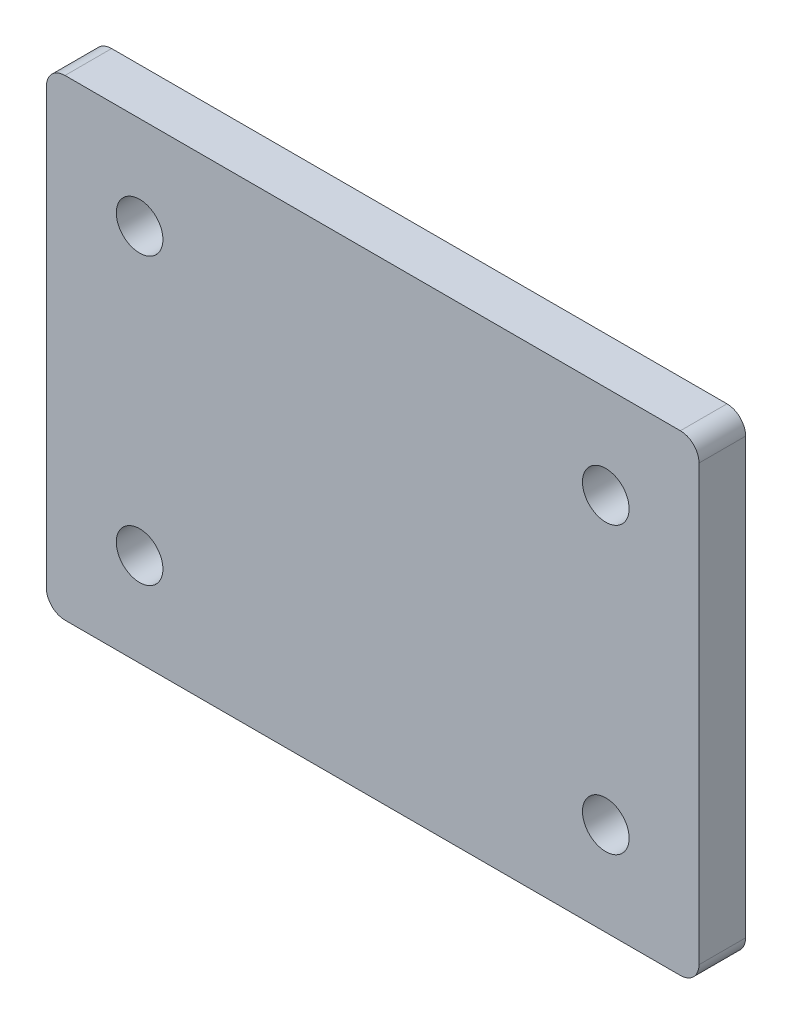
ISO-10303-21;
HEADER;
FILE_DESCRIPTION(('STEP AP214'),'2;1');
FILE_NAME('part.step','',(''),(''),'','','');
FILE_SCHEMA(('AUTOMOTIVE_DESIGN { 1 0 10303 214 1 1 1 1 }'));
ENDSEC;
DATA;
#1=APPLICATION_CONTEXT('core data for automotive mechanical design processes');
#2=APPLICATION_PROTOCOL_DEFINITION('international standard','automotive_design',2000,#1);
#3=PRODUCT_CONTEXT('',#1,'mechanical');
#4=PRODUCT('Part','Part','',(#3));
#5=PRODUCT_RELATED_PRODUCT_CATEGORY('part','',(#4));
#6=PRODUCT_DEFINITION_FORMATION('','',#4);
#7=PRODUCT_DEFINITION_CONTEXT('part definition',#1,'design');
#8=PRODUCT_DEFINITION('design','',#6,#7);
#9=PRODUCT_DEFINITION_SHAPE('','',#8);
#10=(LENGTH_UNIT() NAMED_UNIT(*) SI_UNIT(.MILLI.,.METRE.));
#11=(NAMED_UNIT(*) PLANE_ANGLE_UNIT() SI_UNIT($,.RADIAN.));
#12=(NAMED_UNIT(*) SI_UNIT($,.STERADIAN.) SOLID_ANGLE_UNIT());
#13=UNCERTAINTY_MEASURE_WITH_UNIT(LENGTH_MEASURE(1.E-05),#10,'distance_accuracy_value','');
#14=(GEOMETRIC_REPRESENTATION_CONTEXT(3) GLOBAL_UNCERTAINTY_ASSIGNED_CONTEXT((#13)) GLOBAL_UNIT_ASSIGNED_CONTEXT((#10,
#11,#12)) REPRESENTATION_CONTEXT('',''));
#15=CARTESIAN_POINT('',(0.,0.,0.));
#16=DIRECTION('',(0.,0.,1.));
#17=DIRECTION('',(1.,0.,0.));
#18=AXIS2_PLACEMENT_3D('',#15,#16,#17);
#19=CARTESIAN_POINT('',(44.45,-32.12973,6.35));
#20=DIRECTION('',(-1.,0.,0.));
#21=DIRECTION('',(0.,0.,1.));
#22=AXIS2_PLACEMENT_3D('',#19,#20,#21);
#23=PLANE('',#22);
#24=DIRECTION('',(0.,1.,0.));
#25=VECTOR('',#24,1.);
#26=CARTESIAN_POINT('',(44.45,-32.12973,6.35));
#27=LINE('',#26,#25);
#28=CARTESIAN_POINT('',(44.45,-29.58973,6.35));
#29=VERTEX_POINT('',#28);
#30=CARTESIAN_POINT('',(44.45,29.58973,6.35));
#31=VERTEX_POINT('',#30);
#32=EDGE_CURVE('E126',#29,#31,#27,.T.);
#33=ORIENTED_EDGE('',*,*,#32,.F.);
#34=DIRECTION('',(0.,0.,-1.));
#35=VECTOR('',#34,1.);
#36=CARTESIAN_POINT('',(44.45,-29.58973,6.35));
#37=LINE('',#36,#35);
#38=CARTESIAN_POINT('',(44.45,-29.58973,0.));
#39=VERTEX_POINT('',#38);
#40=EDGE_CURVE('E110',#29,#39,#37,.T.);
#41=ORIENTED_EDGE('',*,*,#40,.T.);
#42=DIRECTION('',(0.,1.,0.));
#43=VECTOR('',#42,1.);
#44=CARTESIAN_POINT('',(44.45,-32.12973,0.));
#45=LINE('',#44,#43);
#46=CARTESIAN_POINT('',(44.45,29.58973,0.));
#47=VERTEX_POINT('',#46);
#48=EDGE_CURVE('E123',#39,#47,#45,.T.);
#49=ORIENTED_EDGE('',*,*,#48,.T.);
#50=DIRECTION('',(0.,0.,-1.));
#51=VECTOR('',#50,1.);
#52=CARTESIAN_POINT('',(44.45,29.58973,6.35));
#53=LINE('',#52,#51);
#54=EDGE_CURVE('E129',#47,#31,#53,.F.);
#55=ORIENTED_EDGE('',*,*,#54,.T.);
#56=EDGE_LOOP('',(#33,#41,#49,#55));
#57=FACE_BOUND('',#56,.T.);
#58=ADVANCED_FACE('F39',(#57),#23,.F.);
#59=CARTESIAN_POINT('',(-44.45,32.12973,6.35));
#60=DIRECTION('',(0.,-1.,0.));
#61=DIRECTION('',(0.,0.,-1.));
#62=AXIS2_PLACEMENT_3D('',#59,#60,#61);
#63=PLANE('',#62);
#64=DIRECTION('',(-1.,0.,0.));
#65=VECTOR('',#64,1.);
#66=CARTESIAN_POINT('',(-44.45,32.12973,0.));
#67=LINE('',#66,#65);
#68=CARTESIAN_POINT('',(41.91,32.12973,0.));
#69=VERTEX_POINT('',#68);
#70=CARTESIAN_POINT('',(-41.91,32.12973,0.));
#71=VERTEX_POINT('',#70);
#72=EDGE_CURVE('E134',#69,#71,#67,.T.);
#73=ORIENTED_EDGE('',*,*,#72,.T.);
#74=DIRECTION('',(0.,0.,-1.));
#75=VECTOR('',#74,1.);
#76=CARTESIAN_POINT('',(-41.91,32.12973,6.35));
#77=LINE('',#76,#75);
#78=CARTESIAN_POINT('',(-41.91,32.12973,6.35));
#79=VERTEX_POINT('',#78);
#80=EDGE_CURVE('E11',#71,#79,#77,.F.);
#81=ORIENTED_EDGE('',*,*,#80,.T.);
#82=DIRECTION('',(-1.,0.,0.));
#83=VECTOR('',#82,1.);
#84=CARTESIAN_POINT('',(-44.45,32.12973,6.35));
#85=LINE('',#84,#83);
#86=CARTESIAN_POINT('',(41.91,32.12973,6.35));
#87=VERTEX_POINT('',#86);
#88=EDGE_CURVE('E191',#87,#79,#85,.T.);
#89=ORIENTED_EDGE('',*,*,#88,.F.);
#90=DIRECTION('',(0.,0.,-1.));
#91=VECTOR('',#90,1.);
#92=CARTESIAN_POINT('',(41.91,32.12973,6.35));
#93=LINE('',#92,#91);
#94=EDGE_CURVE('E48',#87,#69,#93,.T.);
#95=ORIENTED_EDGE('',*,*,#94,.T.);
#96=EDGE_LOOP('',(#73,#81,#89,#95));
#97=FACE_BOUND('',#96,.T.);
#98=ADVANCED_FACE('F189',(#97),#63,.F.);
#99=CARTESIAN_POINT('',(-44.45,-32.12973,6.35));
#100=DIRECTION('',(1.,0.,0.));
#101=DIRECTION('',(0.,0.,-1.));
#102=AXIS2_PLACEMENT_3D('',#99,#100,#101);
#103=PLANE('',#102);
#104=DIRECTION('',(0.,-1.,0.));
#105=VECTOR('',#104,1.);
#106=CARTESIAN_POINT('',(-44.45,-32.12973,0.));
#107=LINE('',#106,#105);
#108=CARTESIAN_POINT('',(-44.45,29.58973,0.));
#109=VERTEX_POINT('',#108);
#110=CARTESIAN_POINT('',(-44.45,-29.58973,0.));
#111=VERTEX_POINT('',#110);
#112=EDGE_CURVE('E140',#109,#111,#107,.T.);
#113=ORIENTED_EDGE('',*,*,#112,.T.);
#114=DIRECTION('',(0.,0.,-1.));
#115=VECTOR('',#114,1.);
#116=CARTESIAN_POINT('',(-44.45,-29.58973,6.35));
#117=LINE('',#116,#115);
#118=CARTESIAN_POINT('',(-44.45,-29.58973,6.35));
#119=VERTEX_POINT('',#118);
#120=EDGE_CURVE('E55',#111,#119,#117,.F.);
#121=ORIENTED_EDGE('',*,*,#120,.T.);
#122=DIRECTION('',(0.,-1.,0.));
#123=VECTOR('',#122,1.);
#124=CARTESIAN_POINT('',(-44.45,-32.12973,6.35));
#125=LINE('',#124,#123);
#126=CARTESIAN_POINT('',(-44.45,29.58973,6.35));
#127=VERTEX_POINT('',#126);
#128=EDGE_CURVE('E199',#127,#119,#125,.T.);
#129=ORIENTED_EDGE('',*,*,#128,.F.);
#130=DIRECTION('',(0.,0.,-1.));
#131=VECTOR('',#130,1.);
#132=CARTESIAN_POINT('',(-44.45,29.58973,6.35));
#133=LINE('',#132,#131);
#134=EDGE_CURVE('E179',#127,#109,#133,.T.);
#135=ORIENTED_EDGE('',*,*,#134,.T.);
#136=EDGE_LOOP('',(#113,#121,#129,#135));
#137=FACE_BOUND('',#136,.T.);
#138=ADVANCED_FACE('F198',(#137),#103,.F.);
#139=CARTESIAN_POINT('',(-44.45,-32.12973,6.35));
#140=DIRECTION('',(0.,1.,0.));
#141=DIRECTION('',(0.,0.,1.));
#142=AXIS2_PLACEMENT_3D('',#139,#140,#141);
#143=PLANE('',#142);
#144=DIRECTION('',(1.,0.,0.));
#145=VECTOR('',#144,1.);
#146=CARTESIAN_POINT('',(-44.45,-32.12973,0.));
#147=LINE('',#146,#145);
#148=CARTESIAN_POINT('',(-41.91,-32.12973,0.));
#149=VERTEX_POINT('',#148);
#150=CARTESIAN_POINT('',(41.91,-32.12973,0.));
#151=VERTEX_POINT('',#150);
#152=EDGE_CURVE('E151',#149,#151,#147,.T.);
#153=ORIENTED_EDGE('',*,*,#152,.T.);
#154=DIRECTION('',(0.,0.,-1.));
#155=VECTOR('',#154,1.);
#156=CARTESIAN_POINT('',(41.91,-32.12973,6.35));
#157=LINE('',#156,#155);
#158=CARTESIAN_POINT('',(41.91,-32.12973,6.35));
#159=VERTEX_POINT('',#158);
#160=EDGE_CURVE('E111',#151,#159,#157,.F.);
#161=ORIENTED_EDGE('',*,*,#160,.T.);
#162=DIRECTION('',(1.,0.,0.));
#163=VECTOR('',#162,1.);
#164=CARTESIAN_POINT('',(-44.45,-32.12973,6.35));
#165=LINE('',#164,#163);
#166=CARTESIAN_POINT('',(-41.91,-32.12973,6.35));
#167=VERTEX_POINT('',#166);
#168=EDGE_CURVE('E146',#167,#159,#165,.T.);
#169=ORIENTED_EDGE('',*,*,#168,.F.);
#170=DIRECTION('',(0.,0.,-1.));
#171=VECTOR('',#170,1.);
#172=CARTESIAN_POINT('',(-41.91,-32.12973,6.35));
#173=LINE('',#172,#171);
#174=EDGE_CURVE('E117',#167,#149,#173,.T.);
#175=ORIENTED_EDGE('',*,*,#174,.T.);
#176=EDGE_LOOP('',(#153,#161,#169,#175));
#177=FACE_BOUND('',#176,.T.);
#178=ADVANCED_FACE('F242',(#177),#143,.F.);
#179=CARTESIAN_POINT('',(0.,0.,6.35));
#180=DIRECTION('',(0.,0.,-1.));
#181=DIRECTION('',(-1.,0.,0.));
#182=AXIS2_PLACEMENT_3D('',#179,#180,#181);
#183=PLANE('',#182);
#184=CARTESIAN_POINT('',(31.75,19.42973,6.35));
#185=DIRECTION('',(0.,0.,1.));
#186=DIRECTION('',(1.,0.,0.));
#187=AXIS2_PLACEMENT_3D('',#184,#185,#186);
#188=CIRCLE('',#187,3.175);
#189=CARTESIAN_POINT('',(34.925,19.42973,6.35));
#190=VERTEX_POINT('',#189);
#191=EDGE_CURVE('E217',#190,#190,#188,.T.);
#192=ORIENTED_EDGE('',*,*,#191,.F.);
#193=EDGE_LOOP('',(#192));
#194=FACE_BOUND('',#193,.T.);
#195=CARTESIAN_POINT('',(31.75,-19.42973,6.35));
#196=DIRECTION('',(0.,0.,1.));
#197=DIRECTION('',(1.,0.,0.));
#198=AXIS2_PLACEMENT_3D('',#195,#196,#197);
#199=CIRCLE('',#198,3.175);
#200=CARTESIAN_POINT('',(34.925,-19.42973,6.35));
#201=VERTEX_POINT('',#200);
#202=EDGE_CURVE('E225',#201,#201,#199,.T.);
#203=ORIENTED_EDGE('',*,*,#202,.F.);
#204=EDGE_LOOP('',(#203));
#205=FACE_BOUND('',#204,.T.);
#206=CARTESIAN_POINT('',(-31.75,-19.42973,6.35));
#207=DIRECTION('',(0.,0.,1.));
#208=DIRECTION('',(1.,0.,0.));
#209=AXIS2_PLACEMENT_3D('',#206,#207,#208);
#210=CIRCLE('',#209,3.175);
#211=CARTESIAN_POINT('',(-28.575,-19.42973,6.35));
#212=VERTEX_POINT('',#211);
#213=EDGE_CURVE('E211',#212,#212,#210,.T.);
#214=ORIENTED_EDGE('',*,*,#213,.F.);
#215=EDGE_LOOP('',(#214));
#216=FACE_BOUND('',#215,.T.);
#217=CARTESIAN_POINT('',(-31.75,19.42973,6.35));
#218=DIRECTION('',(0.,0.,1.));
#219=DIRECTION('',(1.,0.,0.));
#220=AXIS2_PLACEMENT_3D('',#217,#218,#219);
#221=CIRCLE('',#220,3.175);
#222=CARTESIAN_POINT('',(-28.575,19.42973,6.35));
#223=VERTEX_POINT('',#222);
#224=EDGE_CURVE('E143',#223,#223,#221,.T.);
#225=ORIENTED_EDGE('',*,*,#224,.F.);
#226=EDGE_LOOP('',(#225));
#227=FACE_BOUND('',#226,.T.);
#228=ORIENTED_EDGE('',*,*,#168,.T.);
#229=CARTESIAN_POINT('',(41.91,-29.58973,6.35));
#230=DIRECTION('',(0.,0.,-1.));
#231=DIRECTION('',(-1.,0.,0.));
#232=AXIS2_PLACEMENT_3D('',#229,#230,#231);
#233=CIRCLE('',#232,2.54);
#234=EDGE_CURVE('E176',#159,#29,#233,.F.);
#235=ORIENTED_EDGE('',*,*,#234,.T.);
#236=ORIENTED_EDGE('',*,*,#32,.T.);
#237=CARTESIAN_POINT('',(41.91,29.58973,6.35));
#238=DIRECTION('',(0.,0.,-1.));
#239=DIRECTION('',(-1.,0.,0.));
#240=AXIS2_PLACEMENT_3D('',#237,#238,#239);
#241=CIRCLE('',#240,2.54);
#242=EDGE_CURVE('E168',#31,#87,#241,.F.);
#243=ORIENTED_EDGE('',*,*,#242,.T.);
#244=ORIENTED_EDGE('',*,*,#88,.T.);
#245=CARTESIAN_POINT('',(-41.91,29.58973,6.35));
#246=DIRECTION('',(0.,0.,-1.));
#247=DIRECTION('',(-1.,0.,0.));
#248=AXIS2_PLACEMENT_3D('',#245,#246,#247);
#249=CIRCLE('',#248,2.54);
#250=EDGE_CURVE('E62',#79,#127,#249,.F.);
#251=ORIENTED_EDGE('',*,*,#250,.T.);
#252=ORIENTED_EDGE('',*,*,#128,.T.);
#253=CARTESIAN_POINT('',(-41.91,-29.58973,6.35));
#254=DIRECTION('',(0.,0.,-1.));
#255=DIRECTION('',(-1.,0.,0.));
#256=AXIS2_PLACEMENT_3D('',#253,#254,#255);
#257=CIRCLE('',#256,2.54);
#258=EDGE_CURVE('E173',#119,#167,#257,.F.);
#259=ORIENTED_EDGE('',*,*,#258,.T.);
#260=EDGE_LOOP('',(#228,#235,#236,#243,#244,#251,#252,#259));
#261=FACE_BOUND('',#260,.T.);
#262=ADVANCED_FACE('F239',(#194,#205,#216,#227,#261),#183,.F.);
#263=CARTESIAN_POINT('',(0.,0.,0.));
#264=DIRECTION('',(0.,0.,-1.));
#265=DIRECTION('',(-1.,0.,0.));
#266=AXIS2_PLACEMENT_3D('',#263,#264,#265);
#267=PLANE('',#266);
#268=CARTESIAN_POINT('',(31.75,19.42973,0.));
#269=DIRECTION('',(0.,0.,1.));
#270=DIRECTION('',(1.,0.,0.));
#271=AXIS2_PLACEMENT_3D('',#268,#269,#270);
#272=CIRCLE('',#271,3.175);
#273=CARTESIAN_POINT('',(34.925,19.42973,0.));
#274=VERTEX_POINT('',#273);
#275=EDGE_CURVE('E213',#274,#274,#272,.T.);
#276=ORIENTED_EDGE('',*,*,#275,.T.);
#277=EDGE_LOOP('',(#276));
#278=FACE_BOUND('',#277,.T.);
#279=CARTESIAN_POINT('',(31.75,-19.42973,0.));
#280=DIRECTION('',(0.,0.,1.));
#281=DIRECTION('',(1.,0.,0.));
#282=AXIS2_PLACEMENT_3D('',#279,#280,#281);
#283=CIRCLE('',#282,3.175);
#284=CARTESIAN_POINT('',(34.925,-19.42973,0.));
#285=VERTEX_POINT('',#284);
#286=EDGE_CURVE('E221',#285,#285,#283,.T.);
#287=ORIENTED_EDGE('',*,*,#286,.T.);
#288=EDGE_LOOP('',(#287));
#289=FACE_BOUND('',#288,.T.);
#290=CARTESIAN_POINT('',(-31.75,-19.42973,0.));
#291=DIRECTION('',(0.,0.,1.));
#292=DIRECTION('',(1.,0.,0.));
#293=AXIS2_PLACEMENT_3D('',#290,#291,#292);
#294=CIRCLE('',#293,3.175);
#295=CARTESIAN_POINT('',(-28.575,-19.42973,0.));
#296=VERTEX_POINT('',#295);
#297=EDGE_CURVE('E229',#296,#296,#294,.T.);
#298=ORIENTED_EDGE('',*,*,#297,.T.);
#299=EDGE_LOOP('',(#298));
#300=FACE_BOUND('',#299,.T.);
#301=CARTESIAN_POINT('',(-31.75,19.42973,0.));
#302=DIRECTION('',(0.,0.,1.));
#303=DIRECTION('',(1.,0.,0.));
#304=AXIS2_PLACEMENT_3D('',#301,#302,#303);
#305=CIRCLE('',#304,3.175);
#306=CARTESIAN_POINT('',(-28.575,19.42973,0.));
#307=VERTEX_POINT('',#306);
#308=EDGE_CURVE('E135',#307,#307,#305,.T.);
#309=ORIENTED_EDGE('',*,*,#308,.T.);
#310=EDGE_LOOP('',(#309));
#311=FACE_BOUND('',#310,.T.);
#312=ORIENTED_EDGE('',*,*,#48,.F.);
#313=CARTESIAN_POINT('',(41.91,-29.58973,0.));
#314=DIRECTION('',(0.,0.,-1.));
#315=DIRECTION('',(-1.,0.,0.));
#316=AXIS2_PLACEMENT_3D('',#313,#314,#315);
#317=CIRCLE('',#316,2.54);
#318=EDGE_CURVE('E106',#39,#151,#317,.T.);
#319=ORIENTED_EDGE('',*,*,#318,.T.);
#320=ORIENTED_EDGE('',*,*,#152,.F.);
#321=CARTESIAN_POINT('',(-41.91,-29.58973,0.));
#322=DIRECTION('',(0.,0.,-1.));
#323=DIRECTION('',(-1.,0.,0.));
#324=AXIS2_PLACEMENT_3D('',#321,#322,#323);
#325=CIRCLE('',#324,2.54);
#326=EDGE_CURVE('E118',#149,#111,#325,.T.);
#327=ORIENTED_EDGE('',*,*,#326,.T.);
#328=ORIENTED_EDGE('',*,*,#112,.F.);
#329=CARTESIAN_POINT('',(-41.91,29.58973,0.));
#330=DIRECTION('',(0.,0.,-1.));
#331=DIRECTION('',(-1.,0.,0.));
#332=AXIS2_PLACEMENT_3D('',#329,#330,#331);
#333=CIRCLE('',#332,2.54);
#334=EDGE_CURVE('E158',#109,#71,#333,.T.);
#335=ORIENTED_EDGE('',*,*,#334,.T.);
#336=ORIENTED_EDGE('',*,*,#72,.F.);
#337=CARTESIAN_POINT('',(41.91,29.58973,0.));
#338=DIRECTION('',(0.,0.,-1.));
#339=DIRECTION('',(-1.,0.,0.));
#340=AXIS2_PLACEMENT_3D('',#337,#338,#339);
#341=CIRCLE('',#340,2.54);
#342=EDGE_CURVE('E128',#69,#47,#341,.T.);
#343=ORIENTED_EDGE('',*,*,#342,.T.);
#344=EDGE_LOOP('',(#312,#319,#320,#327,#328,#335,#336,#343));
#345=FACE_BOUND('',#344,.T.);
#346=ADVANCED_FACE('F131',(#278,#289,#300,#311,#345),#267,.T.);
#347=CARTESIAN_POINT('',(41.91,-29.58973,6.35));
#348=DIRECTION('',(0.,0.,-1.));
#349=DIRECTION('',(-1.,0.,0.));
#350=AXIS2_PLACEMENT_3D('',#347,#348,#349);
#351=CYLINDRICAL_SURFACE('',#350,2.54);
#352=ORIENTED_EDGE('',*,*,#234,.F.);
#353=ORIENTED_EDGE('',*,*,#160,.F.);
#354=ORIENTED_EDGE('',*,*,#318,.F.);
#355=ORIENTED_EDGE('',*,*,#40,.F.);
#356=EDGE_LOOP('',(#352,#353,#354,#355));
#357=FACE_BOUND('',#356,.T.);
#358=ADVANCED_FACE('F109',(#357),#351,.T.);
#359=CARTESIAN_POINT('',(-41.91,-29.58973,6.35));
#360=DIRECTION('',(0.,0.,-1.));
#361=DIRECTION('',(-1.,0.,0.));
#362=AXIS2_PLACEMENT_3D('',#359,#360,#361);
#363=CYLINDRICAL_SURFACE('',#362,2.54);
#364=ORIENTED_EDGE('',*,*,#258,.F.);
#365=ORIENTED_EDGE('',*,*,#120,.F.);
#366=ORIENTED_EDGE('',*,*,#326,.F.);
#367=ORIENTED_EDGE('',*,*,#174,.F.);
#368=EDGE_LOOP('',(#364,#365,#366,#367));
#369=FACE_BOUND('',#368,.T.);
#370=ADVANCED_FACE('F250',(#369),#363,.T.);
#371=CARTESIAN_POINT('',(-41.91,29.58973,6.35));
#372=DIRECTION('',(0.,0.,-1.));
#373=DIRECTION('',(-1.,0.,0.));
#374=AXIS2_PLACEMENT_3D('',#371,#372,#373);
#375=CYLINDRICAL_SURFACE('',#374,2.54);
#376=ORIENTED_EDGE('',*,*,#250,.F.);
#377=ORIENTED_EDGE('',*,*,#80,.F.);
#378=ORIENTED_EDGE('',*,*,#334,.F.);
#379=ORIENTED_EDGE('',*,*,#134,.F.);
#380=EDGE_LOOP('',(#376,#377,#378,#379));
#381=FACE_BOUND('',#380,.T.);
#382=ADVANCED_FACE('F197',(#381),#375,.T.);
#383=CARTESIAN_POINT('',(41.91,29.58973,6.35));
#384=DIRECTION('',(0.,0.,-1.));
#385=DIRECTION('',(-1.,0.,0.));
#386=AXIS2_PLACEMENT_3D('',#383,#384,#385);
#387=CYLINDRICAL_SURFACE('',#386,2.54);
#388=ORIENTED_EDGE('',*,*,#242,.F.);
#389=ORIENTED_EDGE('',*,*,#54,.F.);
#390=ORIENTED_EDGE('',*,*,#342,.F.);
#391=ORIENTED_EDGE('',*,*,#94,.F.);
#392=EDGE_LOOP('',(#388,#389,#390,#391));
#393=FACE_BOUND('',#392,.T.);
#394=ADVANCED_FACE('F41',(#393),#387,.T.);
#395=CARTESIAN_POINT('',(-31.75,19.42973,0.));
#396=DIRECTION('',(0.,0.,1.));
#397=DIRECTION('',(1.,0.,0.));
#398=AXIS2_PLACEMENT_3D('',#395,#396,#397);
#399=CYLINDRICAL_SURFACE('',#398,3.175);
#400=ORIENTED_EDGE('',*,*,#308,.F.);
#401=EDGE_LOOP('',(#400));
#402=FACE_BOUND('',#401,.T.);
#403=ORIENTED_EDGE('',*,*,#224,.T.);
#404=EDGE_LOOP('',(#403));
#405=FACE_BOUND('',#404,.T.);
#406=ADVANCED_FACE('F272',(#402,#405),#399,.F.);
#407=CARTESIAN_POINT('',(-31.75,-19.42973,0.));
#408=DIRECTION('',(0.,0.,1.));
#409=DIRECTION('',(1.,0.,0.));
#410=AXIS2_PLACEMENT_3D('',#407,#408,#409);
#411=CYLINDRICAL_SURFACE('',#410,3.175);
#412=ORIENTED_EDGE('',*,*,#297,.F.);
#413=EDGE_LOOP('',(#412));
#414=FACE_BOUND('',#413,.T.);
#415=ORIENTED_EDGE('',*,*,#213,.T.);
#416=EDGE_LOOP('',(#415));
#417=FACE_BOUND('',#416,.T.);
#418=ADVANCED_FACE('F237',(#414,#417),#411,.F.);
#419=CARTESIAN_POINT('',(31.75,-19.42973,0.));
#420=DIRECTION('',(0.,0.,1.));
#421=DIRECTION('',(1.,0.,0.));
#422=AXIS2_PLACEMENT_3D('',#419,#420,#421);
#423=CYLINDRICAL_SURFACE('',#422,3.175);
#424=ORIENTED_EDGE('',*,*,#286,.F.);
#425=EDGE_LOOP('',(#424));
#426=FACE_BOUND('',#425,.T.);
#427=ORIENTED_EDGE('',*,*,#202,.T.);
#428=EDGE_LOOP('',(#427));
#429=FACE_BOUND('',#428,.T.);
#430=ADVANCED_FACE('F279',(#426,#429),#423,.F.);
#431=CARTESIAN_POINT('',(31.75,19.42973,0.));
#432=DIRECTION('',(0.,0.,1.));
#433=DIRECTION('',(1.,0.,0.));
#434=AXIS2_PLACEMENT_3D('',#431,#432,#433);
#435=CYLINDRICAL_SURFACE('',#434,3.175);
#436=ORIENTED_EDGE('',*,*,#275,.F.);
#437=EDGE_LOOP('',(#436));
#438=FACE_BOUND('',#437,.T.);
#439=ORIENTED_EDGE('',*,*,#191,.T.);
#440=EDGE_LOOP('',(#439));
#441=FACE_BOUND('',#440,.T.);
#442=ADVANCED_FACE('F276',(#438,#441),#435,.F.);
#443=CLOSED_SHELL('',(#58,#98,#138,#178,#262,#346,#358,#370,#382,#394,#406,#418,#430,#442));
#444=MANIFOLD_SOLID_BREP('B2',#443);
#445=ADVANCED_BREP_SHAPE_REPRESENTATION('',(#18,#444),#14);
#446=SHAPE_DEFINITION_REPRESENTATION(#9,#445);
ENDSEC;
END-ISO-10303-21;
